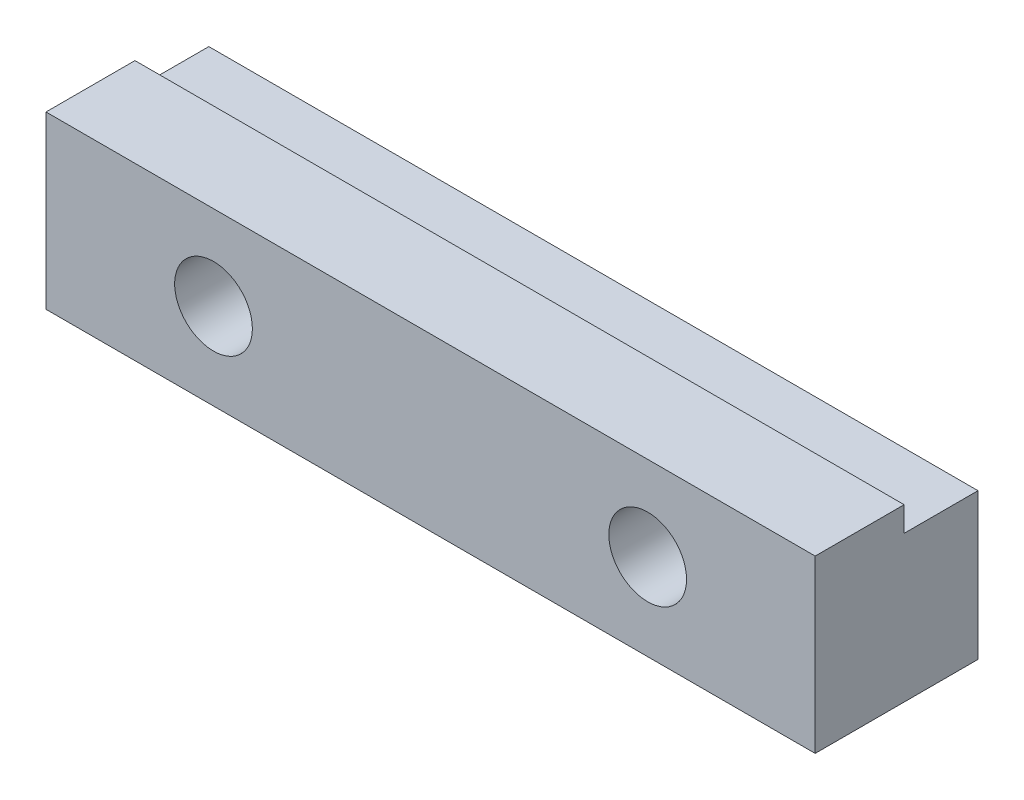
ISO-10303-21;
HEADER;
FILE_DESCRIPTION(('STEP AP214'),'2;1');
FILE_NAME('part.step','',(''),(''),'','','');
FILE_SCHEMA(('AUTOMOTIVE_DESIGN { 1 0 10303 214 1 1 1 1 }'));
ENDSEC;
DATA;
#1=APPLICATION_CONTEXT('core data for automotive mechanical design processes');
#2=APPLICATION_PROTOCOL_DEFINITION('international standard','automotive_design',2000,#1);
#3=PRODUCT_CONTEXT('',#1,'mechanical');
#4=PRODUCT('Part','Part','',(#3));
#5=PRODUCT_RELATED_PRODUCT_CATEGORY('part','',(#4));
#6=PRODUCT_DEFINITION_FORMATION('','',#4);
#7=PRODUCT_DEFINITION_CONTEXT('part definition',#1,'design');
#8=PRODUCT_DEFINITION('design','',#6,#7);
#9=PRODUCT_DEFINITION_SHAPE('','',#8);
#10=(LENGTH_UNIT() NAMED_UNIT(*) SI_UNIT(.MILLI.,.METRE.));
#11=(NAMED_UNIT(*) PLANE_ANGLE_UNIT() SI_UNIT($,.RADIAN.));
#12=(NAMED_UNIT(*) SI_UNIT($,.STERADIAN.) SOLID_ANGLE_UNIT());
#13=UNCERTAINTY_MEASURE_WITH_UNIT(LENGTH_MEASURE(1.E-05),#10,'distance_accuracy_value','');
#14=(GEOMETRIC_REPRESENTATION_CONTEXT(3) GLOBAL_UNCERTAINTY_ASSIGNED_CONTEXT((#13)) GLOBAL_UNIT_ASSIGNED_CONTEXT((#10,
#11,#12)) REPRESENTATION_CONTEXT('',''));
#15=CARTESIAN_POINT('',(0.,0.,0.));
#16=DIRECTION('',(0.,0.,1.));
#17=DIRECTION('',(1.,0.,0.));
#18=AXIS2_PLACEMENT_3D('',#15,#16,#17);
#19=CARTESIAN_POINT('',(22.5,-15.5550000003473,400000.));
#20=DIRECTION('',(0.,1.,0.));
#21=DIRECTION('',(0.,0.,1.));
#22=AXIS2_PLACEMENT_3D('',#19,#20,#21);
#23=PLANE('',#22);
#24=DIRECTION('',(0.,0.,-1.));
#25=VECTOR('',#24,1.);
#26=CARTESIAN_POINT('',(-22.5,-15.5550000003473,400000.));
#27=LINE('',#26,#25);
#28=CARTESIAN_POINT('',(-22.5,-15.5550000000062,4.32000000001084));
#29=VERTEX_POINT('',#28);
#30=CARTESIAN_POINT('',(-22.5,-15.5550000000062,0.));
#31=VERTEX_POINT('',#30);
#32=EDGE_CURVE('E120',#29,#31,#27,.T.);
#33=ORIENTED_EDGE('',*,*,#32,.F.);
#34=DIRECTION('',(-1.,0.,0.));
#35=VECTOR('',#34,1.);
#36=CARTESIAN_POINT('',(22.5,-15.5550000000062,4.32000000001084));
#37=LINE('',#36,#35);
#38=CARTESIAN_POINT('',(22.5,-15.5550000000062,4.32000000001084));
#39=VERTEX_POINT('',#38);
#40=EDGE_CURVE('E11',#39,#29,#37,.T.);
#41=ORIENTED_EDGE('',*,*,#40,.F.);
#42=DIRECTION('',(0.,0.,-1.));
#43=VECTOR('',#42,1.);
#44=CARTESIAN_POINT('',(22.5,-15.5550000003473,400000.));
#45=LINE('',#44,#43);
#46=CARTESIAN_POINT('',(22.5,-15.5550000000062,0.));
#47=VERTEX_POINT('',#46);
#48=EDGE_CURVE('E135',#39,#47,#45,.T.);
#49=ORIENTED_EDGE('',*,*,#48,.T.);
#50=DIRECTION('',(-1.,0.,0.));
#51=VECTOR('',#50,1.);
#52=CARTESIAN_POINT('',(22.5,-15.5550000000062,0.));
#53=LINE('',#52,#51);
#54=EDGE_CURVE('E38',#47,#31,#53,.T.);
#55=ORIENTED_EDGE('',*,*,#54,.T.);
#56=EDGE_LOOP('',(#33,#41,#49,#55));
#57=FACE_BOUND('',#56,.T.);
#58=ADVANCED_FACE('F35',(#57),#23,.T.);
#59=CARTESIAN_POINT('',(22.5,-291550.,4.31999999983645));
#60=DIRECTION('',(0.,0.,-1.));
#61=DIRECTION('',(0.,1.,0.));
#62=AXIS2_PLACEMENT_3D('',#59,#60,#61);
#63=PLANE('',#62);
#64=DIRECTION('',(0.,-1.,0.));
#65=VECTOR('',#64,1.);
#66=CARTESIAN_POINT('',(-22.5,-291550.,4.31999999983645));
#67=LINE('',#66,#65);
#68=CARTESIAN_POINT('',(-22.5,-14.1049999999723,4.32000000001085));
#69=VERTEX_POINT('',#68);
#70=EDGE_CURVE('E133',#69,#29,#67,.T.);
#71=ORIENTED_EDGE('',*,*,#70,.F.);
#72=DIRECTION('',(-1.,0.,0.));
#73=VECTOR('',#72,1.);
#74=CARTESIAN_POINT('',(22.5,-14.1049999999723,4.32000000001085));
#75=LINE('',#74,#73);
#76=CARTESIAN_POINT('',(22.5,-14.1049999999723,4.32000000001085));
#77=VERTEX_POINT('',#76);
#78=EDGE_CURVE('E44',#77,#69,#75,.T.);
#79=ORIENTED_EDGE('',*,*,#78,.F.);
#80=DIRECTION('',(0.,-1.,0.));
#81=VECTOR('',#80,1.);
#82=CARTESIAN_POINT('',(22.5,-291550.,4.31999999983645));
#83=LINE('',#82,#81);
#84=EDGE_CURVE('E110',#77,#39,#83,.T.);
#85=ORIENTED_EDGE('',*,*,#84,.T.);
#86=ORIENTED_EDGE('',*,*,#40,.T.);
#87=EDGE_LOOP('',(#71,#79,#85,#86));
#88=FACE_BOUND('',#87,.T.);
#89=ADVANCED_FACE('F143',(#88),#63,.T.);
#90=CARTESIAN_POINT('',(22.5,-14.1049999999723,400000.));
#91=DIRECTION('',(0.,1.,0.));
#92=DIRECTION('',(0.,0.,1.));
#93=AXIS2_PLACEMENT_3D('',#90,#91,#92);
#94=PLANE('',#93);
#95=DIRECTION('',(0.,0.,-1.));
#96=VECTOR('',#95,1.);
#97=CARTESIAN_POINT('',(-22.5,-14.1049999999723,400000.));
#98=LINE('',#97,#96);
#99=CARTESIAN_POINT('',(-22.5,-14.1049999999723,9.52499999999645));
#100=VERTEX_POINT('',#99);
#101=EDGE_CURVE('E97',#100,#69,#98,.T.);
#102=ORIENTED_EDGE('',*,*,#101,.F.);
#103=DIRECTION('',(-1.,0.,0.));
#104=VECTOR('',#103,1.);
#105=CARTESIAN_POINT('',(22.5,-14.1049999999723,9.52499999999645));
#106=LINE('',#105,#104);
#107=CARTESIAN_POINT('',(22.5,-14.1049999999723,9.52499999999645));
#108=VERTEX_POINT('',#107);
#109=EDGE_CURVE('E92',#108,#100,#106,.T.);
#110=ORIENTED_EDGE('',*,*,#109,.F.);
#111=DIRECTION('',(0.,0.,-1.));
#112=VECTOR('',#111,1.);
#113=CARTESIAN_POINT('',(22.5,-14.1049999999723,400000.));
#114=LINE('',#113,#112);
#115=EDGE_CURVE('E95',#108,#77,#114,.T.);
#116=ORIENTED_EDGE('',*,*,#115,.T.);
#117=ORIENTED_EDGE('',*,*,#78,.T.);
#118=EDGE_LOOP('',(#102,#110,#116,#117));
#119=FACE_BOUND('',#118,.T.);
#120=ADVANCED_FACE('F94',(#119),#94,.T.);
#121=CARTESIAN_POINT('',(22.5,-291550.,9.52499999993961));
#122=DIRECTION('',(0.,0.,1.));
#123=DIRECTION('',(0.,-1.,0.));
#124=AXIS2_PLACEMENT_3D('',#121,#122,#123);
#125=PLANE('',#124);
#126=CARTESIAN_POINT('',(12.7,-19.05,9.52499999999645));
#127=DIRECTION('',(0.,0.,1.));
#128=DIRECTION('',(1.,0.,0.));
#129=AXIS2_PLACEMENT_3D('',#126,#127,#128);
#130=CIRCLE('',#129,2.2729);
#131=CARTESIAN_POINT('',(14.9729,-19.05,9.52499999999645));
#132=VERTEX_POINT('',#131);
#133=EDGE_CURVE('E124',#132,#132,#130,.T.);
#134=ORIENTED_EDGE('',*,*,#133,.F.);
#135=EDGE_LOOP('',(#134));
#136=FACE_BOUND('',#135,.T.);
#137=CARTESIAN_POINT('',(-12.7,-19.05,9.52499999999645));
#138=DIRECTION('',(0.,0.,1.));
#139=DIRECTION('',(1.,0.,0.));
#140=AXIS2_PLACEMENT_3D('',#137,#138,#139);
#141=CIRCLE('',#140,2.2729);
#142=CARTESIAN_POINT('',(-10.4271,-19.05,9.52499999999645));
#143=VERTEX_POINT('',#142);
#144=EDGE_CURVE('E173',#143,#143,#141,.T.);
#145=ORIENTED_EDGE('',*,*,#144,.F.);
#146=EDGE_LOOP('',(#145));
#147=FACE_BOUND('',#146,.T.);
#148=DIRECTION('',(0.,1.,0.));
#149=VECTOR('',#148,1.);
#150=CARTESIAN_POINT('',(-22.5,-291550.,9.52499999993961));
#151=LINE('',#150,#149);
#152=CARTESIAN_POINT('',(-22.5,-24.10500000002,9.52499999999018));
#153=VERTEX_POINT('',#152);
#154=EDGE_CURVE('E130',#153,#100,#151,.T.);
#155=ORIENTED_EDGE('',*,*,#154,.F.);
#156=DIRECTION('',(-1.,0.,0.));
#157=VECTOR('',#156,1.);
#158=CARTESIAN_POINT('',(22.5,-24.10500000002,9.52499999999018));
#159=LINE('',#158,#157);
#160=CARTESIAN_POINT('',(22.5,-24.10500000002,9.52499999999018));
#161=VERTEX_POINT('',#160);
#162=EDGE_CURVE('E102',#161,#153,#159,.T.);
#163=ORIENTED_EDGE('',*,*,#162,.F.);
#164=DIRECTION('',(0.,1.,0.));
#165=VECTOR('',#164,1.);
#166=CARTESIAN_POINT('',(22.5,-291550.,9.52499999993961));
#167=LINE('',#166,#165);
#168=EDGE_CURVE('E108',#161,#108,#167,.T.);
#169=ORIENTED_EDGE('',*,*,#168,.T.);
#170=ORIENTED_EDGE('',*,*,#109,.T.);
#171=EDGE_LOOP('',(#155,#163,#169,#170));
#172=FACE_BOUND('',#171,.T.);
#173=ADVANCED_FACE('F112',(#136,#147,#172),#125,.T.);
#174=CARTESIAN_POINT('',(22.5,-24.10500000002,400000.));
#175=DIRECTION('',(0.,-1.,0.));
#176=DIRECTION('',(0.,0.,-1.));
#177=AXIS2_PLACEMENT_3D('',#174,#175,#176);
#178=PLANE('',#177);
#179=DIRECTION('',(0.,0.,1.));
#180=VECTOR('',#179,1.);
#181=CARTESIAN_POINT('',(-22.5,-24.10500000002,400000.));
#182=LINE('',#181,#180);
#183=CARTESIAN_POINT('',(-22.5,-24.10500000002,0.));
#184=VERTEX_POINT('',#183);
#185=EDGE_CURVE('E127',#184,#153,#182,.T.);
#186=ORIENTED_EDGE('',*,*,#185,.F.);
#187=DIRECTION('',(-1.,0.,0.));
#188=VECTOR('',#187,1.);
#189=CARTESIAN_POINT('',(22.5,-24.10500000002,0.));
#190=LINE('',#189,#188);
#191=CARTESIAN_POINT('',(22.5,-24.10500000002,0.));
#192=VERTEX_POINT('',#191);
#193=EDGE_CURVE('E138',#192,#184,#190,.T.);
#194=ORIENTED_EDGE('',*,*,#193,.F.);
#195=DIRECTION('',(0.,0.,1.));
#196=VECTOR('',#195,1.);
#197=CARTESIAN_POINT('',(22.5,-24.10500000002,400000.));
#198=LINE('',#197,#196);
#199=EDGE_CURVE('E113',#192,#161,#198,.T.);
#200=ORIENTED_EDGE('',*,*,#199,.T.);
#201=ORIENTED_EDGE('',*,*,#162,.T.);
#202=EDGE_LOOP('',(#186,#194,#200,#201));
#203=FACE_BOUND('',#202,.T.);
#204=ADVANCED_FACE('F156',(#203),#178,.T.);
#205=CARTESIAN_POINT('',(22.5,-291550.,0.));
#206=DIRECTION('',(0.,0.,-1.));
#207=DIRECTION('',(-1.,0.,0.));
#208=AXIS2_PLACEMENT_3D('',#205,#206,#207);
#209=PLANE('',#208);
#210=CARTESIAN_POINT('',(12.7,-19.05,0.));
#211=DIRECTION('',(0.,0.,1.));
#212=DIRECTION('',(1.,0.,0.));
#213=AXIS2_PLACEMENT_3D('',#210,#211,#212);
#214=CIRCLE('',#213,2.2729);
#215=CARTESIAN_POINT('',(14.9729,-19.05,0.));
#216=VERTEX_POINT('',#215);
#217=EDGE_CURVE('E168',#216,#216,#214,.T.);
#218=ORIENTED_EDGE('',*,*,#217,.T.);
#219=EDGE_LOOP('',(#218));
#220=FACE_BOUND('',#219,.T.);
#221=CARTESIAN_POINT('',(-12.7,-19.05,0.));
#222=DIRECTION('',(0.,0.,1.));
#223=DIRECTION('',(1.,0.,0.));
#224=AXIS2_PLACEMENT_3D('',#221,#222,#223);
#225=CIRCLE('',#224,2.2729);
#226=CARTESIAN_POINT('',(-10.4271,-19.05,0.));
#227=VERTEX_POINT('',#226);
#228=EDGE_CURVE('E171',#227,#227,#225,.T.);
#229=ORIENTED_EDGE('',*,*,#228,.T.);
#230=EDGE_LOOP('',(#229));
#231=FACE_BOUND('',#230,.T.);
#232=DIRECTION('',(0.,-1.,0.));
#233=VECTOR('',#232,1.);
#234=CARTESIAN_POINT('',(-22.5,-291550.,0.));
#235=LINE('',#234,#233);
#236=EDGE_CURVE('E123',#31,#184,#235,.T.);
#237=ORIENTED_EDGE('',*,*,#236,.F.);
#238=ORIENTED_EDGE('',*,*,#54,.F.);
#239=DIRECTION('',(0.,-1.,0.));
#240=VECTOR('',#239,1.);
#241=CARTESIAN_POINT('',(22.5,-291550.,0.));
#242=LINE('',#241,#240);
#243=EDGE_CURVE('E115',#47,#192,#242,.T.);
#244=ORIENTED_EDGE('',*,*,#243,.T.);
#245=ORIENTED_EDGE('',*,*,#193,.T.);
#246=EDGE_LOOP('',(#237,#238,#244,#245));
#247=FACE_BOUND('',#246,.T.);
#248=ADVANCED_FACE('F140',(#220,#231,#247),#209,.T.);
#249=CARTESIAN_POINT('',(22.5,0.,0.));
#250=DIRECTION('',(-1.,0.,0.));
#251=DIRECTION('',(0.,0.,1.));
#252=AXIS2_PLACEMENT_3D('',#249,#250,#251);
#253=PLANE('',#252);
#254=ORIENTED_EDGE('',*,*,#48,.F.);
#255=ORIENTED_EDGE('',*,*,#84,.F.);
#256=ORIENTED_EDGE('',*,*,#115,.F.);
#257=ORIENTED_EDGE('',*,*,#168,.F.);
#258=ORIENTED_EDGE('',*,*,#199,.F.);
#259=ORIENTED_EDGE('',*,*,#243,.F.);
#260=EDGE_LOOP('',(#254,#255,#256,#257,#258,#259));
#261=FACE_BOUND('',#260,.T.);
#262=ADVANCED_FACE('F106',(#261),#253,.F.);
#263=CARTESIAN_POINT('',(-22.5,0.,0.));
#264=DIRECTION('',(-1.,0.,0.));
#265=DIRECTION('',(0.,0.,1.));
#266=AXIS2_PLACEMENT_3D('',#263,#264,#265);
#267=PLANE('',#266);
#268=ORIENTED_EDGE('',*,*,#32,.T.);
#269=ORIENTED_EDGE('',*,*,#236,.T.);
#270=ORIENTED_EDGE('',*,*,#185,.T.);
#271=ORIENTED_EDGE('',*,*,#154,.T.);
#272=ORIENTED_EDGE('',*,*,#101,.T.);
#273=ORIENTED_EDGE('',*,*,#70,.T.);
#274=EDGE_LOOP('',(#268,#269,#270,#271,#272,#273));
#275=FACE_BOUND('',#274,.T.);
#276=ADVANCED_FACE('F142',(#275),#267,.T.);
#277=CARTESIAN_POINT('',(-12.7,-19.05,9.52499999999645));
#278=DIRECTION('',(0.,0.,-1.));
#279=DIRECTION('',(-1.,0.,0.));
#280=AXIS2_PLACEMENT_3D('',#277,#278,#279);
#281=CYLINDRICAL_SURFACE('',#280,2.2729);
#282=ORIENTED_EDGE('',*,*,#144,.T.);
#283=EDGE_LOOP('',(#282));
#284=FACE_BOUND('',#283,.T.);
#285=ORIENTED_EDGE('',*,*,#228,.F.);
#286=EDGE_LOOP('',(#285));
#287=FACE_BOUND('',#286,.T.);
#288=ADVANCED_FACE('F188',(#284,#287),#281,.F.);
#289=CARTESIAN_POINT('',(12.7,-19.05,9.52499999999645));
#290=DIRECTION('',(0.,0.,-1.));
#291=DIRECTION('',(-1.,0.,0.));
#292=AXIS2_PLACEMENT_3D('',#289,#290,#291);
#293=CYLINDRICAL_SURFACE('',#292,2.2729);
#294=ORIENTED_EDGE('',*,*,#133,.T.);
#295=EDGE_LOOP('',(#294));
#296=FACE_BOUND('',#295,.T.);
#297=ORIENTED_EDGE('',*,*,#217,.F.);
#298=EDGE_LOOP('',(#297));
#299=FACE_BOUND('',#298,.T.);
#300=ADVANCED_FACE('F183',(#296,#299),#293,.F.);
#301=CLOSED_SHELL('',(#58,#89,#120,#173,#204,#248,#262,#276,#288,#300));
#302=MANIFOLD_SOLID_BREP('B2',#301);
#303=ADVANCED_BREP_SHAPE_REPRESENTATION('',(#18,#302),#14);
#304=SHAPE_DEFINITION_REPRESENTATION(#9,#303);
ENDSEC;
END-ISO-10303-21;
